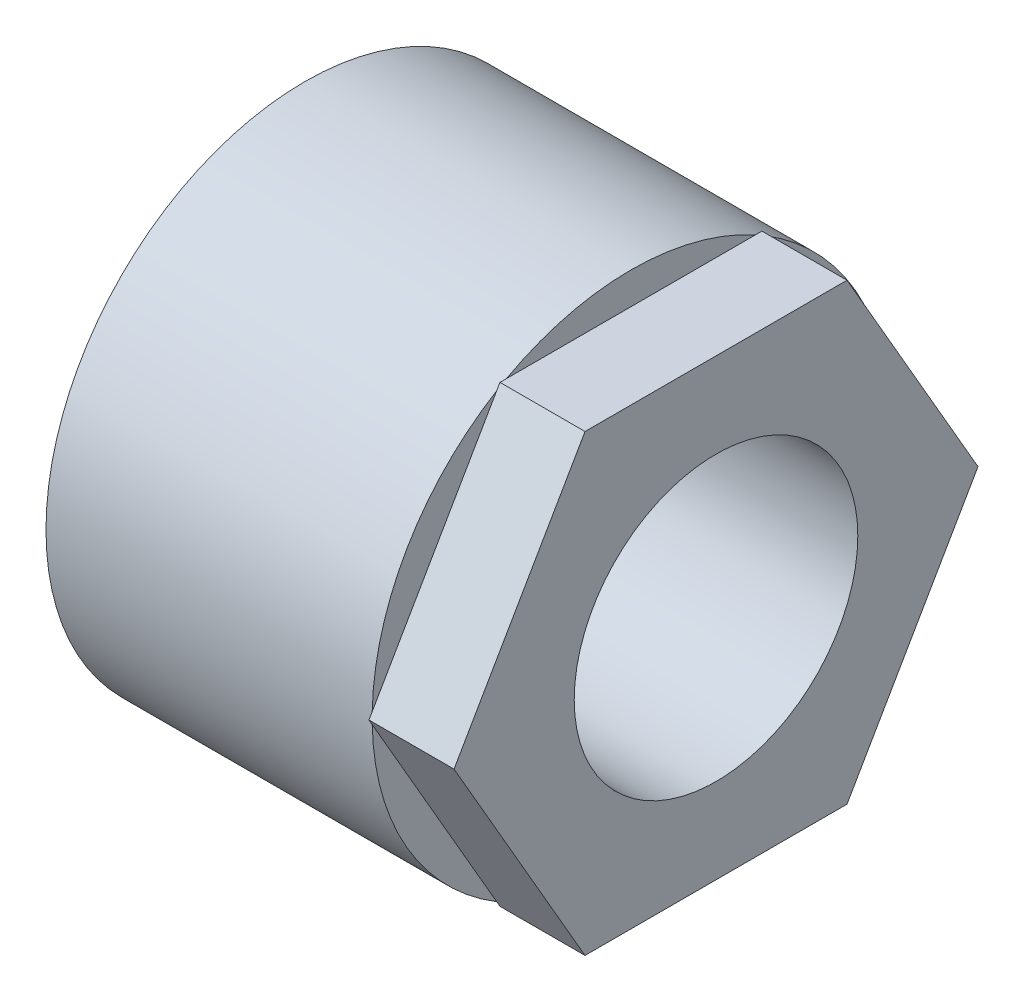
ISO-10303-21;
HEADER;
FILE_DESCRIPTION(('STEP AP214'),'2;1');
FILE_NAME('part.step','',(''),(''),'','','');
FILE_SCHEMA(('AUTOMOTIVE_DESIGN { 1 0 10303 214 1 1 1 1 }'));
ENDSEC;
DATA;
#1=APPLICATION_CONTEXT('core data for automotive mechanical design processes');
#2=APPLICATION_PROTOCOL_DEFINITION('international standard','automotive_design',2000,#1);
#3=PRODUCT_CONTEXT('',#1,'mechanical');
#4=PRODUCT('Part','Part','',(#3));
#5=PRODUCT_RELATED_PRODUCT_CATEGORY('part','',(#4));
#6=PRODUCT_DEFINITION_FORMATION('','',#4);
#7=PRODUCT_DEFINITION_CONTEXT('part definition',#1,'design');
#8=PRODUCT_DEFINITION('design','',#6,#7);
#9=PRODUCT_DEFINITION_SHAPE('','',#8);
#10=(LENGTH_UNIT() NAMED_UNIT(*) SI_UNIT(.MILLI.,.METRE.));
#11=(NAMED_UNIT(*) PLANE_ANGLE_UNIT() SI_UNIT($,.RADIAN.));
#12=(NAMED_UNIT(*) SI_UNIT($,.STERADIAN.) SOLID_ANGLE_UNIT());
#13=UNCERTAINTY_MEASURE_WITH_UNIT(LENGTH_MEASURE(1.E-05),#10,'distance_accuracy_value','');
#14=(GEOMETRIC_REPRESENTATION_CONTEXT(3) GLOBAL_UNCERTAINTY_ASSIGNED_CONTEXT((#13)) GLOBAL_UNIT_ASSIGNED_CONTEXT((#10,
#11,#12)) REPRESENTATION_CONTEXT('',''));
#15=CARTESIAN_POINT('',(0.,0.,0.));
#16=DIRECTION('',(0.,0.,1.));
#17=DIRECTION('',(1.,0.,0.));
#18=AXIS2_PLACEMENT_3D('',#15,#16,#17);
#19=CARTESIAN_POINT('',(23.,18.25,0.));
#20=DIRECTION('',(-1.,0.,0.));
#21=DIRECTION('',(0.,0.,1.));
#22=AXIS2_PLACEMENT_3D('',#19,#20,#21);
#23=PLANE('',#22);
#24=DIRECTION('',(0.,0.866025403784442,-0.499999999999995));
#25=VECTOR('',#24,1.);
#26=CARTESIAN_POINT('',(23.,-15.9999999999999,-9.23760430703419));
#27=LINE('',#26,#25);
#28=CARTESIAN_POINT('',(23.,-15.6024255997674,-9.46714399403134));
#29=VERTEX_POINT('',#28);
#30=CARTESIAN_POINT('',(23.,-0.397574400232521,-18.2456689270709));
#31=VERTEX_POINT('',#30);
#32=EDGE_CURVE('E11',#29,#31,#27,.T.);
#33=ORIENTED_EDGE('',*,*,#32,.F.);
#34=CARTESIAN_POINT('',(23.,0.,0.));
#35=DIRECTION('',(-1.,0.,0.));
#36=DIRECTION('',(0.,0.,1.));
#37=AXIS2_PLACEMENT_3D('',#34,#35,#36);
#38=CIRCLE('',#37,18.25);
#39=EDGE_CURVE('E247',#31,#29,#38,.T.);
#40=ORIENTED_EDGE('',*,*,#39,.F.);
#41=EDGE_LOOP('',(#33,#40));
#42=FACE_BOUND('',#41,.T.);
#43=ADVANCED_FACE('F39',(#42),#23,.F.);
#44=DIRECTION('',(0.,0.,-1.));
#45=VECTOR('',#44,1.);
#46=CARTESIAN_POINT('',(23.,-16.0000000000001,9.23760430703386));
#47=LINE('',#46,#45);
#48=CARTESIAN_POINT('',(23.,-16.0000000000001,8.77852493303958));
#49=VERTEX_POINT('',#48);
#50=CARTESIAN_POINT('',(23.,-15.9999999999999,-8.77852493303991));
#51=VERTEX_POINT('',#50);
#52=EDGE_CURVE('E48',#49,#51,#47,.T.);
#53=ORIENTED_EDGE('',*,*,#52,.F.);
#54=EDGE_CURVE('E251',#51,#49,#38,.T.);
#55=ORIENTED_EDGE('',*,*,#54,.F.);
#56=EDGE_LOOP('',(#53,#55));
#57=FACE_BOUND('',#56,.T.);
#58=ADVANCED_FACE('F212',(#57),#23,.F.);
#59=DIRECTION('',(0.,-0.866025403784434,-0.500000000000007));
#60=VECTOR('',#59,1.);
#61=CARTESIAN_POINT('',(23.,-1.29011692214505E-13,18.475208614068));
#62=LINE('',#61,#60);
#63=CARTESIAN_POINT('',(23.,-0.397574400232626,18.2456689270709));
#64=VERTEX_POINT('',#63);
#65=CARTESIAN_POINT('',(23.,-15.6024255997676,9.467143994031));
#66=VERTEX_POINT('',#65);
#67=EDGE_CURVE('E57',#64,#66,#62,.T.);
#68=ORIENTED_EDGE('',*,*,#67,.F.);
#69=EDGE_CURVE('E60',#66,#64,#38,.T.);
#70=ORIENTED_EDGE('',*,*,#69,.F.);
#71=EDGE_LOOP('',(#68,#70));
#72=FACE_BOUND('',#71,.T.);
#73=ADVANCED_FACE('F219',(#72),#23,.F.);
#74=DIRECTION('',(0.,-0.866025403784441,0.499999999999995));
#75=VECTOR('',#74,1.);
#76=CARTESIAN_POINT('',(23.,16.,9.23760430703408));
#77=LINE('',#76,#75);
#78=CARTESIAN_POINT('',(23.,15.6024255997674,9.46714399403122));
#79=VERTEX_POINT('',#78);
#80=CARTESIAN_POINT('',(23.,0.397574400232375,18.2456689270709));
#81=VERTEX_POINT('',#80);
#82=EDGE_CURVE('E180',#79,#81,#77,.T.);
#83=ORIENTED_EDGE('',*,*,#82,.F.);
#84=EDGE_CURVE('E160',#81,#79,#38,.T.);
#85=ORIENTED_EDGE('',*,*,#84,.F.);
#86=EDGE_LOOP('',(#83,#85));
#87=FACE_BOUND('',#86,.T.);
#88=ADVANCED_FACE('F231',(#87),#23,.F.);
#89=DIRECTION('',(0.,0.,1.));
#90=VECTOR('',#89,1.);
#91=CARTESIAN_POINT('',(23.,16.,-9.23760430703397));
#92=LINE('',#91,#90);
#93=CARTESIAN_POINT('',(23.,16.,-8.77852493303969));
#94=VERTEX_POINT('',#93);
#95=CARTESIAN_POINT('',(23.,16.,8.7785249330398));
#96=VERTEX_POINT('',#95);
#97=EDGE_CURVE('E175',#94,#96,#92,.T.);
#98=ORIENTED_EDGE('',*,*,#97,.F.);
#99=EDGE_CURVE('E293',#96,#94,#38,.T.);
#100=ORIENTED_EDGE('',*,*,#99,.F.);
#101=EDGE_LOOP('',(#98,#100));
#102=FACE_BOUND('',#101,.T.);
#103=ADVANCED_FACE('F224',(#102),#23,.F.);
#104=DIRECTION('',(0.,0.866025403784438,0.500000000000001));
#105=VECTOR('',#104,1.);
#106=CARTESIAN_POINT('',(23.,0.,-18.475208614068));
#107=LINE('',#106,#105);
#108=CARTESIAN_POINT('',(23.,0.397574400232503,-18.2456689270709));
#109=VERTEX_POINT('',#108);
#110=CARTESIAN_POINT('',(23.,15.6024255997675,-9.46714399403112));
#111=VERTEX_POINT('',#110);
#112=EDGE_CURVE('E171',#109,#111,#107,.T.);
#113=ORIENTED_EDGE('',*,*,#112,.F.);
#114=EDGE_CURVE('E235',#111,#109,#38,.T.);
#115=ORIENTED_EDGE('',*,*,#114,.F.);
#116=EDGE_LOOP('',(#113,#115));
#117=FACE_BOUND('',#116,.T.);
#118=ADVANCED_FACE('F215',(#117),#23,.F.);
#119=CARTESIAN_POINT('',(-5.,0.,0.));
#120=DIRECTION('',(-1.,0.,0.));
#121=DIRECTION('',(0.,0.,1.));
#122=AXIS2_PLACEMENT_3D('',#119,#120,#121);
#123=CYLINDRICAL_SURFACE('',#122,10.);
#124=CARTESIAN_POINT('',(0.,0.,0.));
#125=DIRECTION('',(-1.,0.,0.));
#126=DIRECTION('',(0.,0.,1.));
#127=AXIS2_PLACEMENT_3D('',#124,#125,#126);
#128=CIRCLE('',#127,10.);
#129=CARTESIAN_POINT('',(0.,0.,10.));
#130=VERTEX_POINT('',#129);
#131=EDGE_CURVE('E43',#130,#130,#128,.T.);
#132=ORIENTED_EDGE('',*,*,#131,.T.);
#133=EDGE_LOOP('',(#132));
#134=FACE_BOUND('',#133,.T.);
#135=CARTESIAN_POINT('',(29.,0.,0.));
#136=DIRECTION('',(1.,0.,0.));
#137=DIRECTION('',(0.,0.,-1.));
#138=AXIS2_PLACEMENT_3D('',#135,#136,#137);
#139=CIRCLE('',#138,10.);
#140=CARTESIAN_POINT('',(29.,0.,-10.));
#141=VERTEX_POINT('',#140);
#142=EDGE_CURVE('E186',#141,#141,#139,.T.);
#143=ORIENTED_EDGE('',*,*,#142,.T.);
#144=EDGE_LOOP('',(#143));
#145=FACE_BOUND('',#144,.T.);
#146=ADVANCED_FACE('F41',(#134,#145),#123,.F.);
#147=CARTESIAN_POINT('',(0.,10.,0.));
#148=DIRECTION('',(1.,0.,0.));
#149=DIRECTION('',(0.,0.,-1.));
#150=AXIS2_PLACEMENT_3D('',#147,#148,#149);
#151=PLANE('',#150);
#152=ORIENTED_EDGE('',*,*,#131,.F.);
#153=EDGE_LOOP('',(#152));
#154=FACE_BOUND('',#153,.T.);
#155=CARTESIAN_POINT('',(0.,0.,0.));
#156=DIRECTION('',(-1.,0.,0.));
#157=DIRECTION('',(0.,0.,1.));
#158=AXIS2_PLACEMENT_3D('',#155,#156,#157);
#159=CIRCLE('',#158,18.25);
#160=CARTESIAN_POINT('',(0.,0.,18.25));
#161=VERTEX_POINT('',#160);
#162=EDGE_CURVE('E165',#161,#161,#159,.T.);
#163=ORIENTED_EDGE('',*,*,#162,.T.);
#164=EDGE_LOOP('',(#163));
#165=FACE_BOUND('',#164,.T.);
#166=ADVANCED_FACE('F230',(#154,#165),#151,.F.);
#167=CARTESIAN_POINT('',(-5.,0.,0.));
#168=DIRECTION('',(-1.,0.,0.));
#169=DIRECTION('',(0.,0.,1.));
#170=AXIS2_PLACEMENT_3D('',#167,#168,#169);
#171=CYLINDRICAL_SURFACE('',#170,18.25);
#172=ORIENTED_EDGE('',*,*,#162,.F.);
#173=EDGE_LOOP('',(#172));
#174=FACE_BOUND('',#173,.T.);
#175=ORIENTED_EDGE('',*,*,#84,.T.);
#176=EDGE_CURVE('E166',#79,#96,#38,.T.);
#177=ORIENTED_EDGE('',*,*,#176,.T.);
#178=ORIENTED_EDGE('',*,*,#99,.T.);
#179=EDGE_CURVE('E244',#94,#111,#38,.T.);
#180=ORIENTED_EDGE('',*,*,#179,.T.);
#181=ORIENTED_EDGE('',*,*,#114,.T.);
#182=EDGE_CURVE('E241',#109,#31,#38,.T.);
#183=ORIENTED_EDGE('',*,*,#182,.T.);
#184=ORIENTED_EDGE('',*,*,#39,.T.);
#185=EDGE_CURVE('E248',#29,#51,#38,.T.);
#186=ORIENTED_EDGE('',*,*,#185,.T.);
#187=ORIENTED_EDGE('',*,*,#54,.T.);
#188=EDGE_CURVE('E254',#49,#66,#38,.T.);
#189=ORIENTED_EDGE('',*,*,#188,.T.);
#190=ORIENTED_EDGE('',*,*,#69,.T.);
#191=EDGE_CURVE('E157',#64,#81,#38,.T.);
#192=ORIENTED_EDGE('',*,*,#191,.T.);
#193=EDGE_LOOP('',(#175,#177,#178,#180,#181,#183,#184,#186,#187,#189,#190,#192));
#194=FACE_BOUND('',#193,.T.);
#195=ADVANCED_FACE('F239',(#174,#194),#171,.T.);
#196=CARTESIAN_POINT('',(23.,0.,0.));
#197=DIRECTION('',(1.,0.,0.));
#198=DIRECTION('',(0.,0.,-1.));
#199=AXIS2_PLACEMENT_3D('',#196,#197,#198);
#200=PLANE('',#199);
#201=ORIENTED_EDGE('',*,*,#176,.F.);
#202=CARTESIAN_POINT('',(23.,16.,9.23760430703408));
#203=VERTEX_POINT('',#202);
#204=EDGE_CURVE('E275',#203,#79,#77,.T.);
#205=ORIENTED_EDGE('',*,*,#204,.F.);
#206=EDGE_CURVE('E183',#96,#203,#92,.T.);
#207=ORIENTED_EDGE('',*,*,#206,.F.);
#208=EDGE_LOOP('',(#201,#205,#207));
#209=FACE_BOUND('',#208,.T.);
#210=ADVANCED_FACE('F208',(#209),#200,.F.);
#211=ORIENTED_EDGE('',*,*,#179,.F.);
#212=CARTESIAN_POINT('',(23.,16.,-9.23760430703397));
#213=VERTEX_POINT('',#212);
#214=EDGE_CURVE('E182',#213,#94,#92,.T.);
#215=ORIENTED_EDGE('',*,*,#214,.F.);
#216=EDGE_CURVE('E178',#111,#213,#107,.T.);
#217=ORIENTED_EDGE('',*,*,#216,.F.);
#218=EDGE_LOOP('',(#211,#215,#217));
#219=FACE_BOUND('',#218,.T.);
#220=ADVANCED_FACE('F295',(#219),#200,.F.);
#221=ORIENTED_EDGE('',*,*,#182,.F.);
#222=CARTESIAN_POINT('',(23.,0.,-18.475208614068));
#223=VERTEX_POINT('',#222);
#224=EDGE_CURVE('E177',#223,#109,#107,.T.);
#225=ORIENTED_EDGE('',*,*,#224,.F.);
#226=EDGE_CURVE('E51',#31,#223,#27,.T.);
#227=ORIENTED_EDGE('',*,*,#226,.F.);
#228=EDGE_LOOP('',(#221,#225,#227));
#229=FACE_BOUND('',#228,.T.);
#230=ADVANCED_FACE('F246',(#229),#200,.F.);
#231=ORIENTED_EDGE('',*,*,#185,.F.);
#232=CARTESIAN_POINT('',(23.,-15.9999999999999,-9.23760430703419));
#233=VERTEX_POINT('',#232);
#234=EDGE_CURVE('E50',#233,#29,#27,.T.);
#235=ORIENTED_EDGE('',*,*,#234,.F.);
#236=EDGE_CURVE('E271',#51,#233,#47,.T.);
#237=ORIENTED_EDGE('',*,*,#236,.F.);
#238=EDGE_LOOP('',(#231,#235,#237));
#239=FACE_BOUND('',#238,.T.);
#240=ADVANCED_FACE('F209',(#239),#200,.F.);
#241=ORIENTED_EDGE('',*,*,#188,.F.);
#242=CARTESIAN_POINT('',(23.,-16.0000000000001,9.23760430703386));
#243=VERTEX_POINT('',#242);
#244=EDGE_CURVE('E151',#243,#49,#47,.T.);
#245=ORIENTED_EDGE('',*,*,#244,.F.);
#246=EDGE_CURVE('E272',#66,#243,#62,.T.);
#247=ORIENTED_EDGE('',*,*,#246,.F.);
#248=EDGE_LOOP('',(#241,#245,#247));
#249=FACE_BOUND('',#248,.T.);
#250=ADVANCED_FACE('F200',(#249),#200,.F.);
#251=CARTESIAN_POINT('',(29.,0.,0.));
#252=DIRECTION('',(1.,0.,0.));
#253=DIRECTION('',(0.,0.,-1.));
#254=AXIS2_PLACEMENT_3D('',#251,#252,#253);
#255=PLANE('',#254);
#256=DIRECTION('',(0.,0.866025403784442,-0.499999999999995));
#257=VECTOR('',#256,1.);
#258=CARTESIAN_POINT('',(29.,-15.9999999999999,-9.23760430703419));
#259=LINE('',#258,#257);
#260=CARTESIAN_POINT('',(29.,-15.9999999999999,-9.23760430703419));
#261=VERTEX_POINT('',#260);
#262=CARTESIAN_POINT('',(29.,0.,-18.475208614068));
#263=VERTEX_POINT('',#262);
#264=EDGE_CURVE('E141',#261,#263,#259,.T.);
#265=ORIENTED_EDGE('',*,*,#264,.T.);
#266=DIRECTION('',(0.,0.866025403784438,0.500000000000001));
#267=VECTOR('',#266,1.);
#268=CARTESIAN_POINT('',(29.,0.,-18.475208614068));
#269=LINE('',#268,#267);
#270=CARTESIAN_POINT('',(29.,16.,-9.23760430703397));
#271=VERTEX_POINT('',#270);
#272=EDGE_CURVE('E130',#263,#271,#269,.T.);
#273=ORIENTED_EDGE('',*,*,#272,.T.);
#274=DIRECTION('',(0.,0.,1.));
#275=VECTOR('',#274,1.);
#276=CARTESIAN_POINT('',(29.,16.,-9.23760430703397));
#277=LINE('',#276,#275);
#278=CARTESIAN_POINT('',(29.,16.,9.23760430703408));
#279=VERTEX_POINT('',#278);
#280=EDGE_CURVE('E140',#271,#279,#277,.T.);
#281=ORIENTED_EDGE('',*,*,#280,.T.);
#282=DIRECTION('',(0.,-0.866025403784441,0.499999999999995));
#283=VECTOR('',#282,1.);
#284=CARTESIAN_POINT('',(29.,16.,9.23760430703408));
#285=LINE('',#284,#283);
#286=CARTESIAN_POINT('',(29.,-1.29011692214505E-13,18.475208614068));
#287=VERTEX_POINT('',#286);
#288=EDGE_CURVE('E192',#279,#287,#285,.T.);
#289=ORIENTED_EDGE('',*,*,#288,.T.);
#290=DIRECTION('',(0.,-0.866025403784434,-0.500000000000007));
#291=VECTOR('',#290,1.);
#292=CARTESIAN_POINT('',(29.,-1.29011692214505E-13,18.475208614068));
#293=LINE('',#292,#291);
#294=CARTESIAN_POINT('',(29.,-16.0000000000001,9.23760430703386));
#295=VERTEX_POINT('',#294);
#296=EDGE_CURVE('E190',#287,#295,#293,.T.);
#297=ORIENTED_EDGE('',*,*,#296,.T.);
#298=DIRECTION('',(0.,0.,-1.));
#299=VECTOR('',#298,1.);
#300=CARTESIAN_POINT('',(29.,-16.0000000000001,9.23760430703386));
#301=LINE('',#300,#299);
#302=EDGE_CURVE('E147',#295,#261,#301,.T.);
#303=ORIENTED_EDGE('',*,*,#302,.T.);
#304=EDGE_LOOP('',(#265,#273,#281,#289,#297,#303));
#305=FACE_BOUND('',#304,.T.);
#306=ORIENTED_EDGE('',*,*,#142,.F.);
#307=EDGE_LOOP('',(#306));
#308=FACE_BOUND('',#307,.T.);
#309=ADVANCED_FACE('F144',(#305,#308),#255,.T.);
#310=ORIENTED_EDGE('',*,*,#191,.F.);
#311=CARTESIAN_POINT('',(23.,-1.29011692214505E-13,18.475208614068));
#312=VERTEX_POINT('',#311);
#313=EDGE_CURVE('E262',#312,#64,#62,.T.);
#314=ORIENTED_EDGE('',*,*,#313,.F.);
#315=EDGE_CURVE('E263',#81,#312,#77,.T.);
#316=ORIENTED_EDGE('',*,*,#315,.F.);
#317=EDGE_LOOP('',(#310,#314,#316));
#318=FACE_BOUND('',#317,.T.);
#319=ADVANCED_FACE('F199',(#318),#200,.F.);
#320=CARTESIAN_POINT('',(29.,-15.9999999999999,-9.23760430703419));
#321=DIRECTION('',(0.,0.499999999999995,0.866025403784441));
#322=DIRECTION('',(0.,-0.866025403784442,0.499999999999995));
#323=AXIS2_PLACEMENT_3D('',#320,#321,#322);
#324=PLANE('',#323);
#325=ORIENTED_EDGE('',*,*,#234,.T.);
#326=ORIENTED_EDGE('',*,*,#32,.T.);
#327=ORIENTED_EDGE('',*,*,#226,.T.);
#328=DIRECTION('',(-1.,0.,0.));
#329=VECTOR('',#328,1.);
#330=CARTESIAN_POINT('',(29.,0.,-18.475208614068));
#331=LINE('',#330,#329);
#332=EDGE_CURVE('E135',#263,#223,#331,.T.);
#333=ORIENTED_EDGE('',*,*,#332,.F.);
#334=ORIENTED_EDGE('',*,*,#264,.F.);
#335=DIRECTION('',(-1.,0.,0.));
#336=VECTOR('',#335,1.);
#337=CARTESIAN_POINT('',(29.,-15.9999999999999,-9.23760430703419));
#338=LINE('',#337,#336);
#339=EDGE_CURVE('E189',#261,#233,#338,.T.);
#340=ORIENTED_EDGE('',*,*,#339,.T.);
#341=EDGE_LOOP('',(#325,#326,#327,#333,#334,#340));
#342=FACE_BOUND('',#341,.T.);
#343=ADVANCED_FACE('F154',(#342),#324,.F.);
#344=CARTESIAN_POINT('',(29.,0.,-18.475208614068));
#345=DIRECTION('',(0.,-0.500000000000001,0.866025403784438));
#346=DIRECTION('',(0.,-0.866025403784438,-0.500000000000001));
#347=AXIS2_PLACEMENT_3D('',#344,#345,#346);
#348=PLANE('',#347);
#349=ORIENTED_EDGE('',*,*,#224,.T.);
#350=ORIENTED_EDGE('',*,*,#112,.T.);
#351=ORIENTED_EDGE('',*,*,#216,.T.);
#352=DIRECTION('',(-1.,0.,0.));
#353=VECTOR('',#352,1.);
#354=CARTESIAN_POINT('',(29.,16.,-9.23760430703397));
#355=LINE('',#354,#353);
#356=EDGE_CURVE('E137',#271,#213,#355,.T.);
#357=ORIENTED_EDGE('',*,*,#356,.F.);
#358=ORIENTED_EDGE('',*,*,#272,.F.);
#359=ORIENTED_EDGE('',*,*,#332,.T.);
#360=EDGE_LOOP('',(#349,#350,#351,#357,#358,#359));
#361=FACE_BOUND('',#360,.T.);
#362=ADVANCED_FACE('F133',(#361),#348,.F.);
#363=CARTESIAN_POINT('',(29.,16.,-9.23760430703397));
#364=DIRECTION('',(0.,-1.,0.));
#365=DIRECTION('',(0.,0.,-1.));
#366=AXIS2_PLACEMENT_3D('',#363,#364,#365);
#367=PLANE('',#366);
#368=ORIENTED_EDGE('',*,*,#214,.T.);
#369=ORIENTED_EDGE('',*,*,#97,.T.);
#370=ORIENTED_EDGE('',*,*,#206,.T.);
#371=DIRECTION('',(-1.,0.,0.));
#372=VECTOR('',#371,1.);
#373=CARTESIAN_POINT('',(29.,16.,9.23760430703408));
#374=LINE('',#373,#372);
#375=EDGE_CURVE('E161',#279,#203,#374,.T.);
#376=ORIENTED_EDGE('',*,*,#375,.F.);
#377=ORIENTED_EDGE('',*,*,#280,.F.);
#378=ORIENTED_EDGE('',*,*,#356,.T.);
#379=EDGE_LOOP('',(#368,#369,#370,#376,#377,#378));
#380=FACE_BOUND('',#379,.T.);
#381=ADVANCED_FACE('F286',(#380),#367,.F.);
#382=CARTESIAN_POINT('',(29.,16.,9.23760430703408));
#383=DIRECTION('',(0.,-0.499999999999995,-0.866025403784442));
#384=DIRECTION('',(0.,0.866025403784442,-0.499999999999995));
#385=AXIS2_PLACEMENT_3D('',#382,#383,#384);
#386=PLANE('',#385);
#387=ORIENTED_EDGE('',*,*,#204,.T.);
#388=ORIENTED_EDGE('',*,*,#82,.T.);
#389=ORIENTED_EDGE('',*,*,#315,.T.);
#390=DIRECTION('',(-1.,0.,0.));
#391=VECTOR('',#390,1.);
#392=CARTESIAN_POINT('',(29.,-1.29011692214505E-13,18.475208614068));
#393=LINE('',#392,#391);
#394=EDGE_CURVE('E270',#287,#312,#393,.T.);
#395=ORIENTED_EDGE('',*,*,#394,.F.);
#396=ORIENTED_EDGE('',*,*,#288,.F.);
#397=ORIENTED_EDGE('',*,*,#375,.T.);
#398=EDGE_LOOP('',(#387,#388,#389,#395,#396,#397));
#399=FACE_BOUND('',#398,.T.);
#400=ADVANCED_FACE('F291',(#399),#386,.F.);
#401=CARTESIAN_POINT('',(29.,-1.29011692214505E-13,18.475208614068));
#402=DIRECTION('',(0.,0.500000000000007,-0.866025403784435));
#403=DIRECTION('',(0.,0.866025403784435,0.500000000000007));
#404=AXIS2_PLACEMENT_3D('',#401,#402,#403);
#405=PLANE('',#404);
#406=ORIENTED_EDGE('',*,*,#313,.T.);
#407=ORIENTED_EDGE('',*,*,#67,.T.);
#408=ORIENTED_EDGE('',*,*,#246,.T.);
#409=DIRECTION('',(-1.,0.,0.));
#410=VECTOR('',#409,1.);
#411=CARTESIAN_POINT('',(29.,-16.0000000000001,9.23760430703386));
#412=LINE('',#411,#410);
#413=EDGE_CURVE('E498',#295,#243,#412,.T.);
#414=ORIENTED_EDGE('',*,*,#413,.F.);
#415=ORIENTED_EDGE('',*,*,#296,.F.);
#416=ORIENTED_EDGE('',*,*,#394,.T.);
#417=EDGE_LOOP('',(#406,#407,#408,#414,#415,#416));
#418=FACE_BOUND('',#417,.T.);
#419=ADVANCED_FACE('F267',(#418),#405,.F.);
#420=CARTESIAN_POINT('',(29.,-16.0000000000001,9.23760430703386));
#421=DIRECTION('',(0.,1.,0.));
#422=DIRECTION('',(0.,0.,1.));
#423=AXIS2_PLACEMENT_3D('',#420,#421,#422);
#424=PLANE('',#423);
#425=ORIENTED_EDGE('',*,*,#244,.T.);
#426=ORIENTED_EDGE('',*,*,#52,.T.);
#427=ORIENTED_EDGE('',*,*,#236,.T.);
#428=ORIENTED_EDGE('',*,*,#339,.F.);
#429=ORIENTED_EDGE('',*,*,#302,.F.);
#430=ORIENTED_EDGE('',*,*,#413,.T.);
#431=EDGE_LOOP('',(#425,#426,#427,#428,#429,#430));
#432=FACE_BOUND('',#431,.T.);
#433=ADVANCED_FACE('F302',(#432),#424,.F.);
#434=CLOSED_SHELL('',(#43,#58,#73,#88,#103,#118,#146,#166,#195,#210,#220,#230,#240,#250,#309,
#319,#343,#362,#381,#400,#419,#433));
#435=MANIFOLD_SOLID_BREP('B2',#434);
#436=ADVANCED_BREP_SHAPE_REPRESENTATION('',(#18,#435),#14);
#437=SHAPE_DEFINITION_REPRESENTATION(#9,#436);
ENDSEC;
END-ISO-10303-21;
